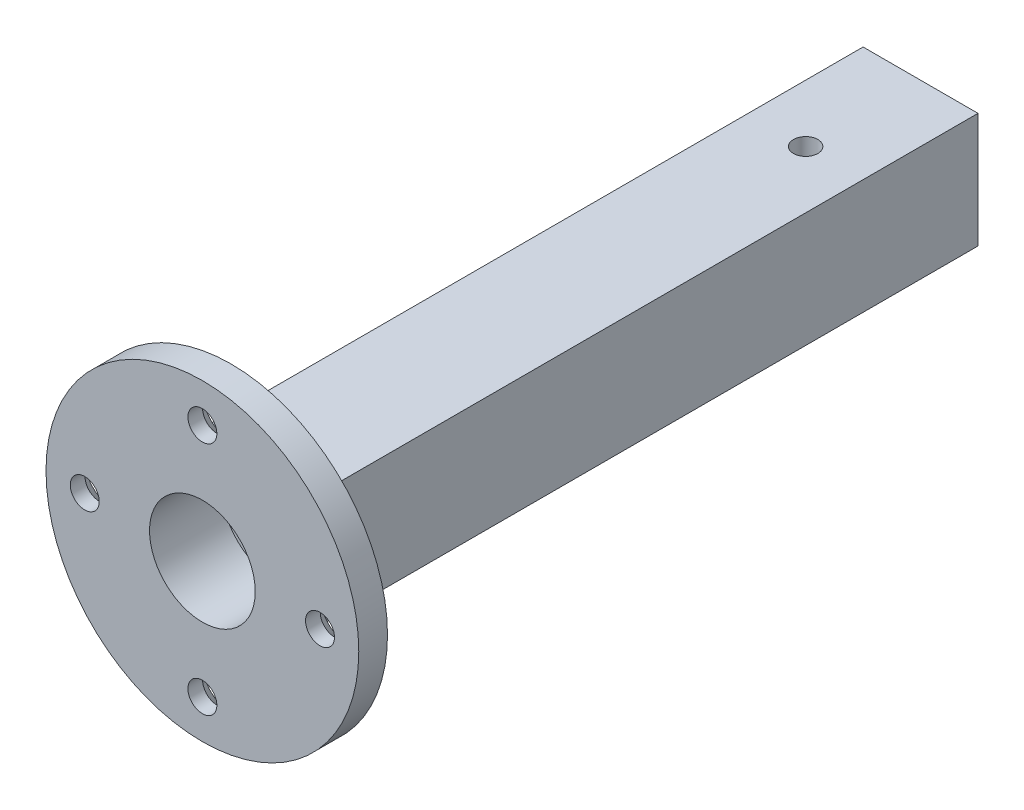
ISO-10303-21;
HEADER;
FILE_DESCRIPTION(('STEP AP214'),'2;1');
FILE_NAME('part.step','',(''),(''),'','','');
FILE_SCHEMA(('AUTOMOTIVE_DESIGN { 1 0 10303 214 1 1 1 1 }'));
ENDSEC;
DATA;
#1=APPLICATION_CONTEXT('core data for automotive mechanical design processes');
#2=APPLICATION_PROTOCOL_DEFINITION('international standard','automotive_design',2000,#1);
#3=PRODUCT_CONTEXT('',#1,'mechanical');
#4=PRODUCT('Part','Part','',(#3));
#5=PRODUCT_RELATED_PRODUCT_CATEGORY('part','',(#4));
#6=PRODUCT_DEFINITION_FORMATION('','',#4);
#7=PRODUCT_DEFINITION_CONTEXT('part definition',#1,'design');
#8=PRODUCT_DEFINITION('design','',#6,#7);
#9=PRODUCT_DEFINITION_SHAPE('','',#8);
#10=(LENGTH_UNIT() NAMED_UNIT(*) SI_UNIT(.MILLI.,.METRE.));
#11=(NAMED_UNIT(*) PLANE_ANGLE_UNIT() SI_UNIT($,.RADIAN.));
#12=(NAMED_UNIT(*) SI_UNIT($,.STERADIAN.) SOLID_ANGLE_UNIT());
#13=UNCERTAINTY_MEASURE_WITH_UNIT(LENGTH_MEASURE(1.E-05),#10,'distance_accuracy_value','');
#14=(GEOMETRIC_REPRESENTATION_CONTEXT(3) GLOBAL_UNCERTAINTY_ASSIGNED_CONTEXT((#13)) GLOBAL_UNIT_ASSIGNED_CONTEXT((#10,
#11,#12)) REPRESENTATION_CONTEXT('',''));
#15=CARTESIAN_POINT('',(0.,0.,0.));
#16=DIRECTION('',(0.,0.,1.));
#17=DIRECTION('',(1.,0.,0.));
#18=AXIS2_PLACEMENT_3D('',#15,#16,#17);
#19=CARTESIAN_POINT('',(0.,0.,76.2));
#20=DIRECTION('',(1.,0.,0.));
#21=DIRECTION('',(0.,0.,-1.));
#22=AXIS2_PLACEMENT_3D('',#19,#20,#21);
#23=PLANE('',#22);
#24=DIRECTION('',(0.,0.,-1.));
#25=VECTOR('',#24,1.);
#26=CARTESIAN_POINT('',(0.,0.,76.2));
#27=LINE('',#26,#25);
#28=CARTESIAN_POINT('',(0.,0.,74.93));
#29=VERTEX_POINT('',#28);
#30=CARTESIAN_POINT('',(0.,0.,0.));
#31=VERTEX_POINT('',#30);
#32=EDGE_CURVE('E93',#29,#31,#27,.T.);
#33=ORIENTED_EDGE('',*,*,#32,.F.);
#34=DIRECTION('',(0.,-1.,0.));
#35=VECTOR('',#34,1.);
#36=CARTESIAN_POINT('',(0.,12.7,74.93));
#37=LINE('',#36,#35);
#38=CARTESIAN_POINT('',(0.,12.7,74.93));
#39=VERTEX_POINT('',#38);
#40=EDGE_CURVE('E63',#29,#39,#37,.F.);
#41=ORIENTED_EDGE('',*,*,#40,.T.);
#42=DIRECTION('',(0.,0.,-1.));
#43=VECTOR('',#42,1.);
#44=CARTESIAN_POINT('',(0.,12.7,76.2));
#45=LINE('',#44,#43);
#46=CARTESIAN_POINT('',(0.,12.7,0.));
#47=VERTEX_POINT('',#46);
#48=EDGE_CURVE('E113',#39,#47,#45,.T.);
#49=ORIENTED_EDGE('',*,*,#48,.T.);
#50=DIRECTION('',(0.,-1.,0.));
#51=VECTOR('',#50,1.);
#52=CARTESIAN_POINT('',(0.,0.,0.));
#53=LINE('',#52,#51);
#54=EDGE_CURVE('E109',#47,#31,#53,.T.);
#55=ORIENTED_EDGE('',*,*,#54,.T.);
#56=EDGE_LOOP('',(#33,#41,#49,#55));
#57=FACE_BOUND('',#56,.T.);
#58=ADVANCED_FACE('F35',(#57),#23,.F.);
#59=CARTESIAN_POINT('',(0.,0.,76.2));
#60=DIRECTION('',(0.,1.,0.));
#61=DIRECTION('',(0.,0.,1.));
#62=AXIS2_PLACEMENT_3D('',#59,#60,#61);
#63=PLANE('',#62);
#64=DIRECTION('',(0.,0.,-1.));
#65=VECTOR('',#64,1.);
#66=CARTESIAN_POINT('',(12.7,0.,76.2));
#67=LINE('',#66,#65);
#68=CARTESIAN_POINT('',(12.7,0.,74.93));
#69=VERTEX_POINT('',#68);
#70=CARTESIAN_POINT('',(12.7,0.,0.));
#71=VERTEX_POINT('',#70);
#72=EDGE_CURVE('E103',#69,#71,#67,.T.);
#73=ORIENTED_EDGE('',*,*,#72,.F.);
#74=DIRECTION('',(1.,0.,0.));
#75=VECTOR('',#74,1.);
#76=CARTESIAN_POINT('',(0.,0.,74.93));
#77=LINE('',#76,#75);
#78=EDGE_CURVE('E100',#69,#29,#77,.F.);
#79=ORIENTED_EDGE('',*,*,#78,.T.);
#80=ORIENTED_EDGE('',*,*,#32,.T.);
#81=DIRECTION('',(1.,0.,0.));
#82=VECTOR('',#81,1.);
#83=CARTESIAN_POINT('',(0.,0.,0.));
#84=LINE('',#83,#82);
#85=EDGE_CURVE('E97',#31,#71,#84,.T.);
#86=ORIENTED_EDGE('',*,*,#85,.T.);
#87=EDGE_LOOP('',(#73,#79,#80,#86));
#88=FACE_BOUND('',#87,.T.);
#89=ADVANCED_FACE('F96',(#88),#63,.F.);
#90=CARTESIAN_POINT('',(12.7,0.,76.2));
#91=DIRECTION('',(-1.,0.,0.));
#92=DIRECTION('',(0.,0.,1.));
#93=AXIS2_PLACEMENT_3D('',#90,#91,#92);
#94=PLANE('',#93);
#95=DIRECTION('',(0.,0.,-1.));
#96=VECTOR('',#95,1.);
#97=CARTESIAN_POINT('',(12.7,12.7,76.2));
#98=LINE('',#97,#96);
#99=CARTESIAN_POINT('',(12.7,12.7,74.93));
#100=VERTEX_POINT('',#99);
#101=CARTESIAN_POINT('',(12.7,12.7,0.));
#102=VERTEX_POINT('',#101);
#103=EDGE_CURVE('E126',#100,#102,#98,.T.);
#104=ORIENTED_EDGE('',*,*,#103,.F.);
#105=DIRECTION('',(0.,1.,0.));
#106=VECTOR('',#105,1.);
#107=CARTESIAN_POINT('',(12.7,0.,74.93));
#108=LINE('',#107,#106);
#109=EDGE_CURVE('E11',#100,#69,#108,.F.);
#110=ORIENTED_EDGE('',*,*,#109,.T.);
#111=ORIENTED_EDGE('',*,*,#72,.T.);
#112=DIRECTION('',(0.,1.,0.));
#113=VECTOR('',#112,1.);
#114=CARTESIAN_POINT('',(12.7,0.,0.));
#115=LINE('',#114,#113);
#116=EDGE_CURVE('E111',#71,#102,#115,.T.);
#117=ORIENTED_EDGE('',*,*,#116,.T.);
#118=EDGE_LOOP('',(#104,#110,#111,#117));
#119=FACE_BOUND('',#118,.T.);
#120=ADVANCED_FACE('F220',(#119),#94,.F.);
#121=CARTESIAN_POINT('',(0.,12.7,76.2));
#122=DIRECTION('',(0.,-1.,0.));
#123=DIRECTION('',(0.,0.,-1.));
#124=AXIS2_PLACEMENT_3D('',#121,#122,#123);
#125=PLANE('',#124);
#126=CARTESIAN_POINT('',(6.35,12.7,12.7));
#127=DIRECTION('',(0.,1.,0.));
#128=DIRECTION('',(0.,0.,1.));
#129=AXIS2_PLACEMENT_3D('',#126,#127,#128);
#130=CIRCLE('',#129,1.3462);
#131=CARTESIAN_POINT('',(6.35,12.7,14.0462));
#132=VERTEX_POINT('',#131);
#133=EDGE_CURVE('E307',#132,#132,#130,.T.);
#134=ORIENTED_EDGE('',*,*,#133,.F.);
#135=EDGE_LOOP('',(#134));
#136=FACE_BOUND('',#135,.T.);
#137=ORIENTED_EDGE('',*,*,#48,.F.);
#138=DIRECTION('',(-1.,0.,0.));
#139=VECTOR('',#138,1.);
#140=CARTESIAN_POINT('',(12.7,12.7,74.93));
#141=LINE('',#140,#139);
#142=EDGE_CURVE('E48',#39,#100,#141,.F.);
#143=ORIENTED_EDGE('',*,*,#142,.T.);
#144=ORIENTED_EDGE('',*,*,#103,.T.);
#145=DIRECTION('',(-1.,0.,0.));
#146=VECTOR('',#145,1.);
#147=CARTESIAN_POINT('',(0.,12.7,0.));
#148=LINE('',#147,#146);
#149=EDGE_CURVE('E123',#102,#47,#148,.T.);
#150=ORIENTED_EDGE('',*,*,#149,.T.);
#151=EDGE_LOOP('',(#137,#143,#144,#150));
#152=FACE_BOUND('',#151,.T.);
#153=ADVANCED_FACE('F212',(#136,#152),#125,.F.);
#154=CARTESIAN_POINT('',(0.,0.,0.));
#155=DIRECTION('',(0.,0.,-1.));
#156=DIRECTION('',(-1.,0.,0.));
#157=AXIS2_PLACEMENT_3D('',#154,#155,#156);
#158=PLANE('',#157);
#159=CARTESIAN_POINT('',(6.35,6.35,0.));
#160=DIRECTION('',(0.,0.,-1.));
#161=DIRECTION('',(-1.,0.,0.));
#162=AXIS2_PLACEMENT_3D('',#159,#160,#161);
#163=CIRCLE('',#162,5.715);
#164=CARTESIAN_POINT('',(0.635,6.35,0.));
#165=VERTEX_POINT('',#164);
#166=EDGE_CURVE('E201',#165,#165,#163,.T.);
#167=ORIENTED_EDGE('',*,*,#166,.F.);
#168=EDGE_LOOP('',(#167));
#169=FACE_BOUND('',#168,.T.);
#170=ORIENTED_EDGE('',*,*,#54,.F.);
#171=ORIENTED_EDGE('',*,*,#149,.F.);
#172=ORIENTED_EDGE('',*,*,#116,.F.);
#173=ORIENTED_EDGE('',*,*,#85,.F.);
#174=EDGE_LOOP('',(#170,#171,#172,#173));
#175=FACE_BOUND('',#174,.T.);
#176=ADVANCED_FACE('F107',(#169,#175),#158,.T.);
#177=CARTESIAN_POINT('',(6.35,6.35,2.54));
#178=DIRECTION('',(0.,0.,-1.));
#179=DIRECTION('',(-1.,0.,0.));
#180=AXIS2_PLACEMENT_3D('',#177,#178,#179);
#181=PLANE('',#180);
#182=CARTESIAN_POINT('',(6.35,6.35,2.54));
#183=DIRECTION('',(0.,0.,-1.));
#184=DIRECTION('',(-1.,0.,0.));
#185=AXIS2_PLACEMENT_3D('',#182,#183,#184);
#186=CIRCLE('',#185,5.715);
#187=CARTESIAN_POINT('',(0.635,6.35,2.54));
#188=VERTEX_POINT('',#187);
#189=EDGE_CURVE('E131',#188,#188,#186,.T.);
#190=ORIENTED_EDGE('',*,*,#189,.T.);
#191=EDGE_LOOP('',(#190));
#192=FACE_BOUND('',#191,.T.);
#193=CARTESIAN_POINT('',(6.35,6.35,2.54));
#194=DIRECTION('',(0.,0.,-1.));
#195=DIRECTION('',(-1.,0.,0.));
#196=AXIS2_PLACEMENT_3D('',#193,#194,#195);
#197=CIRCLE('',#196,4.064);
#198=CARTESIAN_POINT('',(2.286,6.35,2.54));
#199=VERTEX_POINT('',#198);
#200=EDGE_CURVE('E118',#199,#199,#197,.F.);
#201=ORIENTED_EDGE('',*,*,#200,.T.);
#202=EDGE_LOOP('',(#201));
#203=FACE_BOUND('',#202,.T.);
#204=ADVANCED_FACE('F211',(#192,#203),#181,.T.);
#205=CARTESIAN_POINT('',(6.35,6.35,2.54));
#206=DIRECTION('',(0.,0.,-1.));
#207=DIRECTION('',(-1.,0.,0.));
#208=AXIS2_PLACEMENT_3D('',#205,#206,#207);
#209=CYLINDRICAL_SURFACE('',#208,5.715);
#210=ORIENTED_EDGE('',*,*,#189,.F.);
#211=EDGE_LOOP('',(#210));
#212=FACE_BOUND('',#211,.T.);
#213=ORIENTED_EDGE('',*,*,#166,.T.);
#214=EDGE_LOOP('',(#213));
#215=FACE_BOUND('',#214,.T.);
#216=ADVANCED_FACE('F208',(#212,#215),#209,.F.);
#217=CARTESIAN_POINT('',(6.35,6.35,25.4));
#218=DIRECTION('',(0.,0.,-1.));
#219=DIRECTION('',(-1.,0.,0.));
#220=AXIS2_PLACEMENT_3D('',#217,#218,#219);
#221=PLANE('',#220);
#222=CARTESIAN_POINT('',(6.35,6.35,25.4));
#223=DIRECTION('',(0.,0.,-1.));
#224=DIRECTION('',(-1.,0.,0.));
#225=AXIS2_PLACEMENT_3D('',#222,#223,#224);
#226=CIRCLE('',#225,4.064);
#227=CARTESIAN_POINT('',(2.286,6.35,25.4));
#228=VERTEX_POINT('',#227);
#229=EDGE_CURVE('E115',#228,#228,#226,.T.);
#230=ORIENTED_EDGE('',*,*,#229,.T.);
#231=EDGE_LOOP('',(#230));
#232=FACE_BOUND('',#231,.T.);
#233=ADVANCED_FACE('F290',(#232),#221,.T.);
#234=CARTESIAN_POINT('',(6.35,6.35,25.4));
#235=DIRECTION('',(0.,0.,-1.));
#236=DIRECTION('',(-1.,0.,0.));
#237=AXIS2_PLACEMENT_3D('',#234,#235,#236);
#238=CYLINDRICAL_SURFACE('',#237,4.064);
#239=CARTESIAN_POINT('',(6.35,10.414,14.0462));
#240=CARTESIAN_POINT('',(6.42347913668791,10.4140001407623,14.0462002511838));
#241=CARTESIAN_POINT('',(6.49695694574783,10.4119887716011,14.0401643765706));
#242=CARTESIAN_POINT('',(6.64174986832794,10.4041630463826,14.016253153046));
#243=CARTESIAN_POINT('',(6.71306472958287,10.3983482485012,13.9983764286434));
#244=CARTESIAN_POINT('',(6.85142335831928,10.3835478373522,13.9514624121633));
#245=CARTESIAN_POINT('',(6.91847399799829,10.3745674868179,13.9224436366496));
#246=CARTESIAN_POINT('',(7.04675674304806,10.3543536844612,13.8541524445239));
#247=CARTESIAN_POINT('',(7.1079877200774,10.3431197970214,13.8148780450161));
#248=CARTESIAN_POINT('',(7.22499036897811,10.3191518676785,13.7257773029023));
#249=CARTESIAN_POINT('',(7.28053512247818,10.3063822180013,13.6756626141982));
#250=CARTESIAN_POINT('',(7.3826047214189,10.2809789348671,13.5669170215369));
#251=CARTESIAN_POINT('',(7.42912761351038,10.2683453314238,13.508284278107));
#252=CARTESIAN_POINT('',(7.51312150949098,10.2442537663916,13.3821320985374));
#253=CARTESIAN_POINT('',(7.55029871663051,10.2328392532393,13.3144079518127));
#254=CARTESIAN_POINT('',(7.61263913127142,10.2130190698525,13.1732293591019));
#255=CARTESIAN_POINT('',(7.63780595289279,10.2046124946715,13.0997766446851));
#256=CARTESIAN_POINT('',(7.67456207540146,10.1921347051302,12.9518043332213));
#257=CARTESIAN_POINT('',(7.68657614224585,10.1879282733622,12.8774019857715));
#258=CARTESIAN_POINT('',(7.69801349898597,10.1839269426896,12.727527808136));
#259=CARTESIAN_POINT('',(7.6974406222697,10.1841307006494,12.6520563105605));
#260=CARTESIAN_POINT('',(7.68405040643026,10.1888081427407,12.5057975759434));
#261=CARTESIAN_POINT('',(7.67178590591598,10.1930890312265,12.4349524933866));
#262=CARTESIAN_POINT('',(7.63626188795948,10.2051231454281,12.2963888004968));
#263=CARTESIAN_POINT('',(7.61300106944265,10.2128767820306,12.2286705611702));
#264=CARTESIAN_POINT('',(7.55577991566544,10.2311211846816,12.0970205686578));
#265=CARTESIAN_POINT('',(7.52165477859202,10.2416536509354,12.0331664747239));
#266=CARTESIAN_POINT('',(7.44378808770514,10.2642513329801,11.9119155271354));
#267=CARTESIAN_POINT('',(7.40004378411757,10.276316986637,11.8545205270107));
#268=CARTESIAN_POINT('',(7.30151944945012,10.3013815724905,11.7447085393211));
#269=CARTESIAN_POINT('',(7.24628700070472,10.3143965627293,11.692700309631));
#270=CARTESIAN_POINT('',(7.12772401338036,10.3393491664204,11.5985785412448));
#271=CARTESIAN_POINT('',(7.06439271824225,10.3512866790416,11.5564659279984));
#272=CARTESIAN_POINT('',(6.93057097181243,10.3728926150232,11.4830071621015));
#273=CARTESIAN_POINT('',(6.86001709451326,10.3825379298771,11.4517692913398));
#274=CARTESIAN_POINT('',(6.71426017872547,10.3983050495206,11.4017317369654));
#275=CARTESIAN_POINT('',(6.63905874391988,10.4044280622785,11.3829277888261));
#276=CARTESIAN_POINT('',(6.48960277642567,10.4122611580016,11.3590131538685));
#277=CARTESIAN_POINT('',(6.4154458462064,10.4141491618216,11.3533500214624));
#278=CARTESIAN_POINT('',(6.26722730937942,10.4138323699875,11.3543057321357));
#279=CARTESIAN_POINT('',(6.19316568896083,10.4116282554604,11.3609225312389));
#280=CARTESIAN_POINT('',(6.04944297115317,10.403492269121,11.3858124596222));
#281=CARTESIAN_POINT('',(5.97971660884666,10.3976685721565,11.4037475609554));
#282=CARTESIAN_POINT('',(5.84428970843803,10.3829885217623,11.4503434013205));
#283=CARTESIAN_POINT('',(5.77858968367376,10.3741317825794,11.4790055046944));
#284=CARTESIAN_POINT('',(5.65116790424702,10.3539982090476,11.5470725322544));
#285=CARTESIAN_POINT('',(5.58959489413401,10.3426642022482,11.5867385140592));
#286=CARTESIAN_POINT('',(5.4737987480204,10.3188622615181,11.6753799664566));
#287=CARTESIAN_POINT('',(5.4195778402886,10.3063939857187,11.724358248657));
#288=CARTESIAN_POINT('',(5.3174954557137,10.2810205704354,11.8328321989219));
#289=CARTESIAN_POINT('',(5.27002814975376,10.2681209107791,11.8927009874283));
#290=CARTESIAN_POINT('',(5.18576642671859,10.2439163406281,12.0198314408246));
#291=CARTESIAN_POINT('',(5.14897206812968,10.2326114388726,12.0870931462239));
#292=CARTESIAN_POINT('',(5.08727816895325,10.2129886722743,12.2271099542659));
#293=CARTESIAN_POINT('',(5.0623519791998,10.2046641257817,12.299852320622));
#294=CARTESIAN_POINT('',(5.02521293505442,10.1920603019183,12.4488407718796));
#295=CARTESIAN_POINT('',(5.01299444744611,10.1877792321862,12.5250852886429));
#296=CARTESIAN_POINT('',(5.00205352900609,10.1839491856434,12.6747512230212));
#297=CARTESIAN_POINT('',(5.00267765798588,10.1841710866147,12.7481195465021));
#298=CARTESIAN_POINT('',(5.01579923094838,10.1887565036177,12.8936480379726));
#299=CARTESIAN_POINT('',(5.02829598493579,10.1931197789674,12.965808275924));
#300=CARTESIAN_POINT('',(5.064348016877,10.2053267560776,13.1055442108271));
#301=CARTESIAN_POINT('',(5.08769422051415,10.2131045087785,13.1731800605851));
#302=CARTESIAN_POINT('',(5.14461356883309,10.2312404702912,13.3036267534222));
#303=CARTESIAN_POINT('',(5.1781889654924,10.2415992472292,13.3664365302149));
#304=CARTESIAN_POINT('',(5.25630590658991,10.2642878300035,13.4883877348354));
#305=CARTESIAN_POINT('',(5.30125840415099,10.2766834356842,13.5472536124839));
#306=CARTESIAN_POINT('',(5.40015586852548,10.3017706695658,13.6568175756437));
#307=CARTESIAN_POINT('',(5.45410336334356,10.3144623801209,13.7075133570861));
#308=CARTESIAN_POINT('',(5.57194145139303,10.3392953915956,13.8012539679304));
#309=CARTESIAN_POINT('',(5.63613376136349,10.3513969863302,13.8439313389756));
#310=CARTESIAN_POINT('',(5.77117759445019,10.3731491114597,13.9178421114924));
#311=CARTESIAN_POINT('',(5.84202731181497,10.3828003038861,13.949078604987));
#312=CARTESIAN_POINT('',(5.98481827141965,10.3981648841105,13.9978083894084));
#313=CARTESIAN_POINT('',(6.05653766770483,10.4040473988418,14.0158977673161));
#314=CARTESIAN_POINT('',(6.20217221957942,10.4119643704887,14.0400918407545));
#315=CARTESIAN_POINT('',(6.27608678146991,10.4139998584062,14.0461997473324));
#316=CARTESIAN_POINT('',(6.35,10.414,14.0462));
#317=B_SPLINE_CURVE_WITH_KNOTS('',3,(#239,#240,#241,#242,#243,#244,#245,#246,#247,#248,#249,
#250,#251,#252,#253,#254,#255,#256,#257,#258,#259,#260,#261,#262,#263,#264,#265,#266,#267,#268,
#269,#270,#271,#272,#273,#274,#275,#276,#277,#278,#279,#280,#281,#282,#283,#284,#285,#286,#287,
#288,#289,#290,#291,#292,#293,#294,#295,#296,#297,#298,#299,#300,#301,#302,#303,#304,#305,#306,
#307,#308,#309,#310,#311,#312,#313,#314,#315,#316),.UNSPECIFIED.,.T.,.F.,(4,2,2,2,2,2,2,2,2,2,2,
2,2,2,2,2,2,2,2,2,2,2,2,2,2,2,2,2,2,2,2,2,2,2,2,2,2,2,4),(0.,0.220165446766761,
0.440356473517353,0.660183145754393,0.880052352365351,1.10670985271511,1.33341637267514,
1.56654583748516,1.79960510555076,2.02489289008556,2.25011206356232,2.46518396076011,
2.68028131144583,2.8988108070283,3.11740285374137,3.34725568941928,3.57713001266026,
3.80923183150059,4.04125400383492,4.26332988373845,4.48536880275719,4.70107134559777,
4.91680133246215,5.13816641957434,5.359598448576,5.59095941195395,5.82232164313494,
6.05316188713964,6.28389975795379,6.50292796826123,6.7219434501963,6.9369030660191,
7.15191003987435,7.37620199055644,7.60055708409276,7.83350617896469,8.06639227024673,
8.287917733081,8.50938381873691),.UNSPECIFIED.);
#318=CARTESIAN_POINT('',(6.35,10.414,14.0462));
#319=VERTEX_POINT('',#318);
#320=EDGE_CURVE('E39',#319,#319,#317,.T.);
#321=ORIENTED_EDGE('',*,*,#320,.T.);
#322=EDGE_LOOP('',(#321));
#323=FACE_BOUND('',#322,.T.);
#324=ORIENTED_EDGE('',*,*,#229,.F.);
#325=EDGE_LOOP('',(#324));
#326=FACE_BOUND('',#325,.T.);
#327=ORIENTED_EDGE('',*,*,#200,.F.);
#328=EDGE_LOOP('',(#327));
#329=FACE_BOUND('',#328,.T.);
#330=ADVANCED_FACE('F265',(#323,#326,#329),#238,.F.);
#331=CARTESIAN_POINT('',(6.35,6.35,76.2));
#332=DIRECTION('',(0.,0.,1.));
#333=DIRECTION('',(1.,0.,0.));
#334=AXIS2_PLACEMENT_3D('',#331,#332,#333);
#335=PLANE('',#334);
#336=DIRECTION('',(0.,-1.,0.));
#337=VECTOR('',#336,1.);
#338=CARTESIAN_POINT('',(-1.27,0.,76.2));
#339=LINE('',#338,#337);
#340=CARTESIAN_POINT('',(-1.27,13.97,76.2));
#341=VERTEX_POINT('',#340);
#342=CARTESIAN_POINT('',(-1.27,-1.27,76.2));
#343=VERTEX_POINT('',#342);
#344=EDGE_CURVE('E135',#341,#343,#339,.T.);
#345=ORIENTED_EDGE('',*,*,#344,.T.);
#346=DIRECTION('',(1.,0.,0.));
#347=VECTOR('',#346,1.);
#348=CARTESIAN_POINT('',(12.7,-1.27,76.2));
#349=LINE('',#348,#347);
#350=CARTESIAN_POINT('',(13.97,-1.27,76.2));
#351=VERTEX_POINT('',#350);
#352=EDGE_CURVE('E137',#343,#351,#349,.T.);
#353=ORIENTED_EDGE('',*,*,#352,.T.);
#354=DIRECTION('',(0.,1.,0.));
#355=VECTOR('',#354,1.);
#356=CARTESIAN_POINT('',(13.97,12.7,76.2));
#357=LINE('',#356,#355);
#358=CARTESIAN_POINT('',(13.97,13.97,76.2));
#359=VERTEX_POINT('',#358);
#360=EDGE_CURVE('E102',#351,#359,#357,.T.);
#361=ORIENTED_EDGE('',*,*,#360,.T.);
#362=DIRECTION('',(-1.,0.,0.));
#363=VECTOR('',#362,1.);
#364=CARTESIAN_POINT('',(0.,13.97,76.2));
#365=LINE('',#364,#363);
#366=EDGE_CURVE('E133',#359,#341,#365,.T.);
#367=ORIENTED_EDGE('',*,*,#366,.T.);
#368=EDGE_LOOP('',(#345,#353,#361,#367));
#369=FACE_BOUND('',#368,.T.);
#370=CARTESIAN_POINT('',(6.35,19.35,76.2));
#371=DIRECTION('',(0.,0.,-1.));
#372=DIRECTION('',(-1.,0.,0.));
#373=AXIS2_PLACEMENT_3D('',#370,#371,#372);
#374=CIRCLE('',#373,3.15);
#375=CARTESIAN_POINT('',(3.2,19.35,76.2));
#376=VERTEX_POINT('',#375);
#377=EDGE_CURVE('E152',#376,#376,#374,.T.);
#378=ORIENTED_EDGE('',*,*,#377,.F.);
#379=EDGE_LOOP('',(#378));
#380=FACE_BOUND('',#379,.T.);
#381=CARTESIAN_POINT('',(-6.65,6.35,76.2));
#382=DIRECTION('',(0.,0.,-1.));
#383=DIRECTION('',(-1.,0.,0.));
#384=AXIS2_PLACEMENT_3D('',#381,#382,#383);
#385=CIRCLE('',#384,3.15);
#386=CARTESIAN_POINT('',(-9.8,6.35,76.2));
#387=VERTEX_POINT('',#386);
#388=EDGE_CURVE('E170',#387,#387,#385,.T.);
#389=ORIENTED_EDGE('',*,*,#388,.F.);
#390=EDGE_LOOP('',(#389));
#391=FACE_BOUND('',#390,.T.);
#392=CARTESIAN_POINT('',(6.35,-6.65,76.2));
#393=DIRECTION('',(0.,0.,-1.));
#394=DIRECTION('',(-1.,0.,0.));
#395=AXIS2_PLACEMENT_3D('',#392,#393,#394);
#396=CIRCLE('',#395,3.15);
#397=CARTESIAN_POINT('',(3.2,-6.65,76.2));
#398=VERTEX_POINT('',#397);
#399=EDGE_CURVE('E179',#398,#398,#396,.T.);
#400=ORIENTED_EDGE('',*,*,#399,.F.);
#401=EDGE_LOOP('',(#400));
#402=FACE_BOUND('',#401,.T.);
#403=CARTESIAN_POINT('',(19.35,6.35,76.2));
#404=DIRECTION('',(0.,0.,-1.));
#405=DIRECTION('',(-1.,0.,0.));
#406=AXIS2_PLACEMENT_3D('',#403,#404,#405);
#407=CIRCLE('',#406,3.15);
#408=CARTESIAN_POINT('',(16.2,6.35,76.2));
#409=VERTEX_POINT('',#408);
#410=EDGE_CURVE('E188',#409,#409,#407,.T.);
#411=ORIENTED_EDGE('',*,*,#410,.F.);
#412=EDGE_LOOP('',(#411));
#413=FACE_BOUND('',#412,.T.);
#414=CARTESIAN_POINT('',(6.35,6.35,76.2));
#415=DIRECTION('',(0.,0.,1.));
#416=DIRECTION('',(1.,0.,0.));
#417=AXIS2_PLACEMENT_3D('',#414,#415,#416);
#418=CIRCLE('',#417,17.2847);
#419=CARTESIAN_POINT('',(23.6347,6.35,76.2));
#420=VERTEX_POINT('',#419);
#421=EDGE_CURVE('E197',#420,#420,#418,.T.);
#422=ORIENTED_EDGE('',*,*,#421,.F.);
#423=EDGE_LOOP('',(#422));
#424=FACE_BOUND('',#423,.T.);
#425=ADVANCED_FACE('F261',(#369,#380,#391,#402,#413,#424),#335,.F.);
#426=CARTESIAN_POINT('',(6.35,6.35,79.375));
#427=DIRECTION('',(0.,0.,-1.));
#428=DIRECTION('',(-1.,0.,0.));
#429=AXIS2_PLACEMENT_3D('',#426,#427,#428);
#430=CYLINDRICAL_SURFACE('',#429,17.2847);
#431=CARTESIAN_POINT('',(6.35,6.35,79.375));
#432=DIRECTION('',(0.,0.,1.));
#433=DIRECTION('',(1.,0.,0.));
#434=AXIS2_PLACEMENT_3D('',#431,#432,#433);
#435=CIRCLE('',#434,17.2847);
#436=CARTESIAN_POINT('',(23.6347,6.35,79.375));
#437=VERTEX_POINT('',#436);
#438=EDGE_CURVE('E198',#437,#437,#435,.T.);
#439=ORIENTED_EDGE('',*,*,#438,.F.);
#440=EDGE_LOOP('',(#439));
#441=FACE_BOUND('',#440,.T.);
#442=ORIENTED_EDGE('',*,*,#421,.T.);
#443=EDGE_LOOP('',(#442));
#444=FACE_BOUND('',#443,.T.);
#445=ADVANCED_FACE('F264',(#441,#444),#430,.T.);
#446=CARTESIAN_POINT('',(6.35,6.35,79.375));
#447=DIRECTION('',(0.,0.,1.));
#448=DIRECTION('',(1.,0.,0.));
#449=AXIS2_PLACEMENT_3D('',#446,#447,#448);
#450=PLANE('',#449);
#451=CARTESIAN_POINT('',(6.35,6.35,79.375));
#452=DIRECTION('',(0.,0.,1.));
#453=DIRECTION('',(1.,0.,0.));
#454=AXIS2_PLACEMENT_3D('',#451,#452,#453);
#455=CIRCLE('',#454,5.842);
#456=CARTESIAN_POINT('',(12.192,6.35,79.375));
#457=VERTEX_POINT('',#456);
#458=EDGE_CURVE('E165',#457,#457,#455,.T.);
#459=ORIENTED_EDGE('',*,*,#458,.F.);
#460=EDGE_LOOP('',(#459));
#461=FACE_BOUND('',#460,.T.);
#462=CARTESIAN_POINT('',(6.35,19.35,79.375));
#463=DIRECTION('',(0.,0.,-1.));
#464=DIRECTION('',(-1.,0.,0.));
#465=AXIS2_PLACEMENT_3D('',#462,#463,#464);
#466=CIRCLE('',#465,1.6);
#467=CARTESIAN_POINT('',(4.75,19.35,79.375));
#468=VERTEX_POINT('',#467);
#469=EDGE_CURVE('E162',#468,#468,#466,.T.);
#470=ORIENTED_EDGE('',*,*,#469,.T.);
#471=EDGE_LOOP('',(#470));
#472=FACE_BOUND('',#471,.T.);
#473=CARTESIAN_POINT('',(-6.65,6.35,79.375));
#474=DIRECTION('',(0.,0.,-1.));
#475=DIRECTION('',(-1.,0.,0.));
#476=AXIS2_PLACEMENT_3D('',#473,#474,#475);
#477=CIRCLE('',#476,1.6);
#478=CARTESIAN_POINT('',(-8.25,6.35,79.375));
#479=VERTEX_POINT('',#478);
#480=EDGE_CURVE('E176',#479,#479,#477,.T.);
#481=ORIENTED_EDGE('',*,*,#480,.T.);
#482=EDGE_LOOP('',(#481));
#483=FACE_BOUND('',#482,.T.);
#484=CARTESIAN_POINT('',(6.35,-6.65,79.375));
#485=DIRECTION('',(0.,0.,-1.));
#486=DIRECTION('',(-1.,0.,0.));
#487=AXIS2_PLACEMENT_3D('',#484,#485,#486);
#488=CIRCLE('',#487,1.6);
#489=CARTESIAN_POINT('',(4.75,-6.65,79.375));
#490=VERTEX_POINT('',#489);
#491=EDGE_CURVE('E185',#490,#490,#488,.T.);
#492=ORIENTED_EDGE('',*,*,#491,.T.);
#493=EDGE_LOOP('',(#492));
#494=FACE_BOUND('',#493,.T.);
#495=CARTESIAN_POINT('',(19.35,6.35,79.375));
#496=DIRECTION('',(0.,0.,-1.));
#497=DIRECTION('',(-1.,0.,0.));
#498=AXIS2_PLACEMENT_3D('',#495,#496,#497);
#499=CIRCLE('',#498,1.6);
#500=CARTESIAN_POINT('',(17.75,6.35,79.375));
#501=VERTEX_POINT('',#500);
#502=EDGE_CURVE('E194',#501,#501,#499,.T.);
#503=ORIENTED_EDGE('',*,*,#502,.T.);
#504=EDGE_LOOP('',(#503));
#505=FACE_BOUND('',#504,.T.);
#506=ORIENTED_EDGE('',*,*,#438,.T.);
#507=EDGE_LOOP('',(#506));
#508=FACE_BOUND('',#507,.T.);
#509=ADVANCED_FACE('F277',(#461,#472,#483,#494,#505,#508),#450,.T.);
#510=CARTESIAN_POINT('',(19.35,6.35,76.2));
#511=DIRECTION('',(0.,0.,-1.));
#512=DIRECTION('',(-1.,0.,0.));
#513=AXIS2_PLACEMENT_3D('',#510,#511,#512);
#514=CYLINDRICAL_SURFACE('',#513,1.6);
#515=ORIENTED_EDGE('',*,*,#502,.F.);
#516=EDGE_LOOP('',(#515));
#517=FACE_BOUND('',#516,.T.);
#518=CARTESIAN_POINT('',(19.35,6.35,77.75));
#519=DIRECTION('',(0.,0.,-1.));
#520=DIRECTION('',(-1.,0.,0.));
#521=AXIS2_PLACEMENT_3D('',#518,#519,#520);
#522=CIRCLE('',#521,1.6);
#523=CARTESIAN_POINT('',(17.75,6.35,77.75));
#524=VERTEX_POINT('',#523);
#525=EDGE_CURVE('E191',#524,#524,#522,.T.);
#526=ORIENTED_EDGE('',*,*,#525,.T.);
#527=EDGE_LOOP('',(#526));
#528=FACE_BOUND('',#527,.T.);
#529=ADVANCED_FACE('F283',(#517,#528),#514,.F.);
#530=CARTESIAN_POINT('',(19.35,6.35,76.2));
#531=DIRECTION('',(0.,0.,-1.));
#532=DIRECTION('',(-1.,0.,0.));
#533=AXIS2_PLACEMENT_3D('',#530,#531,#532);
#534=CONICAL_SURFACE('',#533,3.15,0.78539816339745);
#535=ORIENTED_EDGE('',*,*,#525,.F.);
#536=EDGE_LOOP('',(#535));
#537=FACE_BOUND('',#536,.T.);
#538=ORIENTED_EDGE('',*,*,#410,.T.);
#539=EDGE_LOOP('',(#538));
#540=FACE_BOUND('',#539,.T.);
#541=ADVANCED_FACE('F334',(#537,#540),#534,.F.);
#542=CARTESIAN_POINT('',(6.35,-6.65,76.2));
#543=DIRECTION('',(0.,0.,-1.));
#544=DIRECTION('',(-1.,0.,0.));
#545=AXIS2_PLACEMENT_3D('',#542,#543,#544);
#546=CYLINDRICAL_SURFACE('',#545,1.6);
#547=ORIENTED_EDGE('',*,*,#491,.F.);
#548=EDGE_LOOP('',(#547));
#549=FACE_BOUND('',#548,.T.);
#550=CARTESIAN_POINT('',(6.35,-6.65,77.75));
#551=DIRECTION('',(0.,0.,-1.));
#552=DIRECTION('',(-1.,0.,0.));
#553=AXIS2_PLACEMENT_3D('',#550,#551,#552);
#554=CIRCLE('',#553,1.6);
#555=CARTESIAN_POINT('',(4.75,-6.65,77.75));
#556=VERTEX_POINT('',#555);
#557=EDGE_CURVE('E182',#556,#556,#554,.T.);
#558=ORIENTED_EDGE('',*,*,#557,.T.);
#559=EDGE_LOOP('',(#558));
#560=FACE_BOUND('',#559,.T.);
#561=ADVANCED_FACE('F340',(#549,#560),#546,.F.);
#562=CARTESIAN_POINT('',(6.35,-6.65,76.2));
#563=DIRECTION('',(0.,0.,-1.));
#564=DIRECTION('',(-1.,0.,0.));
#565=AXIS2_PLACEMENT_3D('',#562,#563,#564);
#566=CONICAL_SURFACE('',#565,3.15,0.78539816339745);
#567=ORIENTED_EDGE('',*,*,#557,.F.);
#568=EDGE_LOOP('',(#567));
#569=FACE_BOUND('',#568,.T.);
#570=ORIENTED_EDGE('',*,*,#399,.T.);
#571=EDGE_LOOP('',(#570));
#572=FACE_BOUND('',#571,.T.);
#573=ADVANCED_FACE('F345',(#569,#572),#566,.F.);
#574=CARTESIAN_POINT('',(-6.65,6.35,76.2));
#575=DIRECTION('',(0.,0.,-1.));
#576=DIRECTION('',(-1.,0.,0.));
#577=AXIS2_PLACEMENT_3D('',#574,#575,#576);
#578=CYLINDRICAL_SURFACE('',#577,1.6);
#579=ORIENTED_EDGE('',*,*,#480,.F.);
#580=EDGE_LOOP('',(#579));
#581=FACE_BOUND('',#580,.T.);
#582=CARTESIAN_POINT('',(-6.65,6.35,77.75));
#583=DIRECTION('',(0.,0.,-1.));
#584=DIRECTION('',(-1.,0.,0.));
#585=AXIS2_PLACEMENT_3D('',#582,#583,#584);
#586=CIRCLE('',#585,1.6);
#587=CARTESIAN_POINT('',(-8.25,6.35,77.75));
#588=VERTEX_POINT('',#587);
#589=EDGE_CURVE('E173',#588,#588,#586,.T.);
#590=ORIENTED_EDGE('',*,*,#589,.T.);
#591=EDGE_LOOP('',(#590));
#592=FACE_BOUND('',#591,.T.);
#593=ADVANCED_FACE('F351',(#581,#592),#578,.F.);
#594=CARTESIAN_POINT('',(-6.65,6.35,76.2));
#595=DIRECTION('',(0.,0.,-1.));
#596=DIRECTION('',(-1.,0.,0.));
#597=AXIS2_PLACEMENT_3D('',#594,#595,#596);
#598=CONICAL_SURFACE('',#597,3.15,0.78539816339745);
#599=ORIENTED_EDGE('',*,*,#589,.F.);
#600=EDGE_LOOP('',(#599));
#601=FACE_BOUND('',#600,.T.);
#602=ORIENTED_EDGE('',*,*,#388,.T.);
#603=EDGE_LOOP('',(#602));
#604=FACE_BOUND('',#603,.T.);
#605=ADVANCED_FACE('F355',(#601,#604),#598,.F.);
#606=CARTESIAN_POINT('',(6.35,19.35,76.2));
#607=DIRECTION('',(0.,0.,-1.));
#608=DIRECTION('',(-1.,0.,0.));
#609=AXIS2_PLACEMENT_3D('',#606,#607,#608);
#610=CYLINDRICAL_SURFACE('',#609,1.6);
#611=ORIENTED_EDGE('',*,*,#469,.F.);
#612=EDGE_LOOP('',(#611));
#613=FACE_BOUND('',#612,.T.);
#614=CARTESIAN_POINT('',(6.35,19.35,77.75));
#615=DIRECTION('',(0.,0.,-1.));
#616=DIRECTION('',(-1.,0.,0.));
#617=AXIS2_PLACEMENT_3D('',#614,#615,#616);
#618=CIRCLE('',#617,1.6);
#619=CARTESIAN_POINT('',(4.75,19.35,77.75));
#620=VERTEX_POINT('',#619);
#621=EDGE_CURVE('E157',#620,#620,#618,.T.);
#622=ORIENTED_EDGE('',*,*,#621,.T.);
#623=EDGE_LOOP('',(#622));
#624=FACE_BOUND('',#623,.T.);
#625=ADVANCED_FACE('F249',(#613,#624),#610,.F.);
#626=CARTESIAN_POINT('',(6.35,19.35,76.2));
#627=DIRECTION('',(0.,0.,-1.));
#628=DIRECTION('',(-1.,0.,0.));
#629=AXIS2_PLACEMENT_3D('',#626,#627,#628);
#630=CONICAL_SURFACE('',#629,3.15,0.78539816339745);
#631=ORIENTED_EDGE('',*,*,#621,.F.);
#632=EDGE_LOOP('',(#631));
#633=FACE_BOUND('',#632,.T.);
#634=ORIENTED_EDGE('',*,*,#377,.T.);
#635=EDGE_LOOP('',(#634));
#636=FACE_BOUND('',#635,.T.);
#637=ADVANCED_FACE('F244',(#633,#636),#630,.F.);
#638=CARTESIAN_POINT('',(6.35,13.97,74.93));
#639=DIRECTION('',(1.,0.,0.));
#640=DIRECTION('',(0.,0.,-1.));
#641=AXIS2_PLACEMENT_3D('',#638,#639,#640);
#642=CYLINDRICAL_SURFACE('',#641,1.27);
#643=CARTESIAN_POINT('',(13.97,13.97,74.93));
#644=DIRECTION('',(0.707106781186547,-0.707106781186547,0.));
#645=DIRECTION('',(-0.707106781186547,-0.707106781186547,0.));
#646=AXIS2_PLACEMENT_3D('',#643,#644,#645);
#647=ELLIPSE('',#646,1.79605122421383,1.27);
#648=EDGE_CURVE('E148',#100,#359,#647,.F.);
#649=ORIENTED_EDGE('',*,*,#648,.F.);
#650=ORIENTED_EDGE('',*,*,#142,.F.);
#651=CARTESIAN_POINT('',(-1.27,13.97,74.93));
#652=DIRECTION('',(0.707106781186547,0.707106781186547,0.));
#653=DIRECTION('',(0.707106781186547,-0.707106781186547,0.));
#654=AXIS2_PLACEMENT_3D('',#651,#652,#653);
#655=ELLIPSE('',#654,1.79605122421383,1.27);
#656=EDGE_CURVE('E150',#341,#39,#655,.T.);
#657=ORIENTED_EDGE('',*,*,#656,.F.);
#658=ORIENTED_EDGE('',*,*,#366,.F.);
#659=EDGE_LOOP('',(#649,#650,#657,#658));
#660=FACE_BOUND('',#659,.T.);
#661=ADVANCED_FACE('F37',(#660),#642,.F.);
#662=CARTESIAN_POINT('',(-1.27,6.35,74.93));
#663=DIRECTION('',(0.,1.,0.));
#664=DIRECTION('',(0.,0.,1.));
#665=AXIS2_PLACEMENT_3D('',#662,#663,#664);
#666=CYLINDRICAL_SURFACE('',#665,1.27);
#667=ORIENTED_EDGE('',*,*,#656,.T.);
#668=ORIENTED_EDGE('',*,*,#40,.F.);
#669=CARTESIAN_POINT('',(-1.27,-1.27,74.93));
#670=DIRECTION('',(-0.707106781186547,0.707106781186547,0.));
#671=DIRECTION('',(0.707106781186547,0.707106781186547,0.));
#672=AXIS2_PLACEMENT_3D('',#669,#670,#671);
#673=ELLIPSE('',#672,1.79605122421383,1.27);
#674=EDGE_CURVE('E145',#343,#29,#673,.T.);
#675=ORIENTED_EDGE('',*,*,#674,.F.);
#676=ORIENTED_EDGE('',*,*,#344,.F.);
#677=EDGE_LOOP('',(#667,#668,#675,#676));
#678=FACE_BOUND('',#677,.T.);
#679=ADVANCED_FACE('F238',(#678),#666,.F.);
#680=CARTESIAN_POINT('',(13.97,6.35,74.93));
#681=DIRECTION('',(0.,-1.,0.));
#682=DIRECTION('',(0.,0.,-1.));
#683=AXIS2_PLACEMENT_3D('',#680,#681,#682);
#684=CYLINDRICAL_SURFACE('',#683,1.27);
#685=ORIENTED_EDGE('',*,*,#648,.T.);
#686=ORIENTED_EDGE('',*,*,#360,.F.);
#687=CARTESIAN_POINT('',(13.97,-1.27,74.93));
#688=DIRECTION('',(-0.707106781186547,-0.707106781186547,0.));
#689=DIRECTION('',(0.707106781186547,-0.707106781186547,0.));
#690=AXIS2_PLACEMENT_3D('',#687,#688,#689);
#691=ELLIPSE('',#690,1.79605122421383,1.27);
#692=EDGE_CURVE('E143',#69,#351,#691,.F.);
#693=ORIENTED_EDGE('',*,*,#692,.F.);
#694=ORIENTED_EDGE('',*,*,#109,.F.);
#695=EDGE_LOOP('',(#685,#686,#693,#694));
#696=FACE_BOUND('',#695,.T.);
#697=ADVANCED_FACE('F235',(#696),#684,.F.);
#698=CARTESIAN_POINT('',(6.35,-1.27,74.93));
#699=DIRECTION('',(-1.,0.,0.));
#700=DIRECTION('',(0.,0.,1.));
#701=AXIS2_PLACEMENT_3D('',#698,#699,#700);
#702=CYLINDRICAL_SURFACE('',#701,1.27);
#703=ORIENTED_EDGE('',*,*,#674,.T.);
#704=ORIENTED_EDGE('',*,*,#78,.F.);
#705=ORIENTED_EDGE('',*,*,#692,.T.);
#706=ORIENTED_EDGE('',*,*,#352,.F.);
#707=EDGE_LOOP('',(#703,#704,#705,#706));
#708=FACE_BOUND('',#707,.T.);
#709=ADVANCED_FACE('F231',(#708),#702,.F.);
#710=CARTESIAN_POINT('',(6.35,6.35,71.375));
#711=DIRECTION('',(0.,0.,1.));
#712=DIRECTION('',(1.,0.,0.));
#713=AXIS2_PLACEMENT_3D('',#710,#711,#712);
#714=CYLINDRICAL_SURFACE('',#713,5.842);
#715=CARTESIAN_POINT('',(6.35,6.35,71.375));
#716=DIRECTION('',(0.,0.,1.));
#717=DIRECTION('',(1.,0.,0.));
#718=AXIS2_PLACEMENT_3D('',#715,#716,#717);
#719=CIRCLE('',#718,5.842);
#720=CARTESIAN_POINT('',(12.192,6.35,71.375));
#721=VERTEX_POINT('',#720);
#722=EDGE_CURVE('E146',#721,#721,#719,.T.);
#723=ORIENTED_EDGE('',*,*,#722,.F.);
#724=EDGE_LOOP('',(#723));
#725=FACE_BOUND('',#724,.T.);
#726=ORIENTED_EDGE('',*,*,#458,.T.);
#727=EDGE_LOOP('',(#726));
#728=FACE_BOUND('',#727,.T.);
#729=ADVANCED_FACE('F234',(#725,#728),#714,.F.);
#730=CARTESIAN_POINT('',(6.35,6.35,71.375));
#731=DIRECTION('',(0.,0.,1.));
#732=DIRECTION('',(1.,0.,0.));
#733=AXIS2_PLACEMENT_3D('',#730,#731,#732);
#734=PLANE('',#733);
#735=ORIENTED_EDGE('',*,*,#722,.T.);
#736=EDGE_LOOP('',(#735));
#737=FACE_BOUND('',#736,.T.);
#738=ADVANCED_FACE('F316',(#737),#734,.T.);
#739=CARTESIAN_POINT('',(6.35,4.7,12.7));
#740=DIRECTION('',(0.,1.,0.));
#741=DIRECTION('',(0.,0.,1.));
#742=AXIS2_PLACEMENT_3D('',#739,#740,#741);
#743=CYLINDRICAL_SURFACE('',#742,1.3462);
#744=ORIENTED_EDGE('',*,*,#133,.T.);
#745=EDGE_LOOP('',(#744));
#746=FACE_BOUND('',#745,.T.);
#747=ORIENTED_EDGE('',*,*,#320,.F.);
#748=EDGE_LOOP('',(#747));
#749=FACE_BOUND('',#748,.T.);
#750=ADVANCED_FACE('F364',(#746,#749),#743,.F.);
#751=CLOSED_SHELL('',(#58,#89,#120,#153,#176,#204,#216,#233,#330,#425,#445,#509,#529,#541,#561,
#573,#593,#605,#625,#637,#661,#679,#697,#709,#729,#738,#750));
#752=MANIFOLD_SOLID_BREP('B2',#751);
#753=ADVANCED_BREP_SHAPE_REPRESENTATION('',(#18,#752),#14);
#754=SHAPE_DEFINITION_REPRESENTATION(#9,#753);
ENDSEC;
END-ISO-10303-21;
